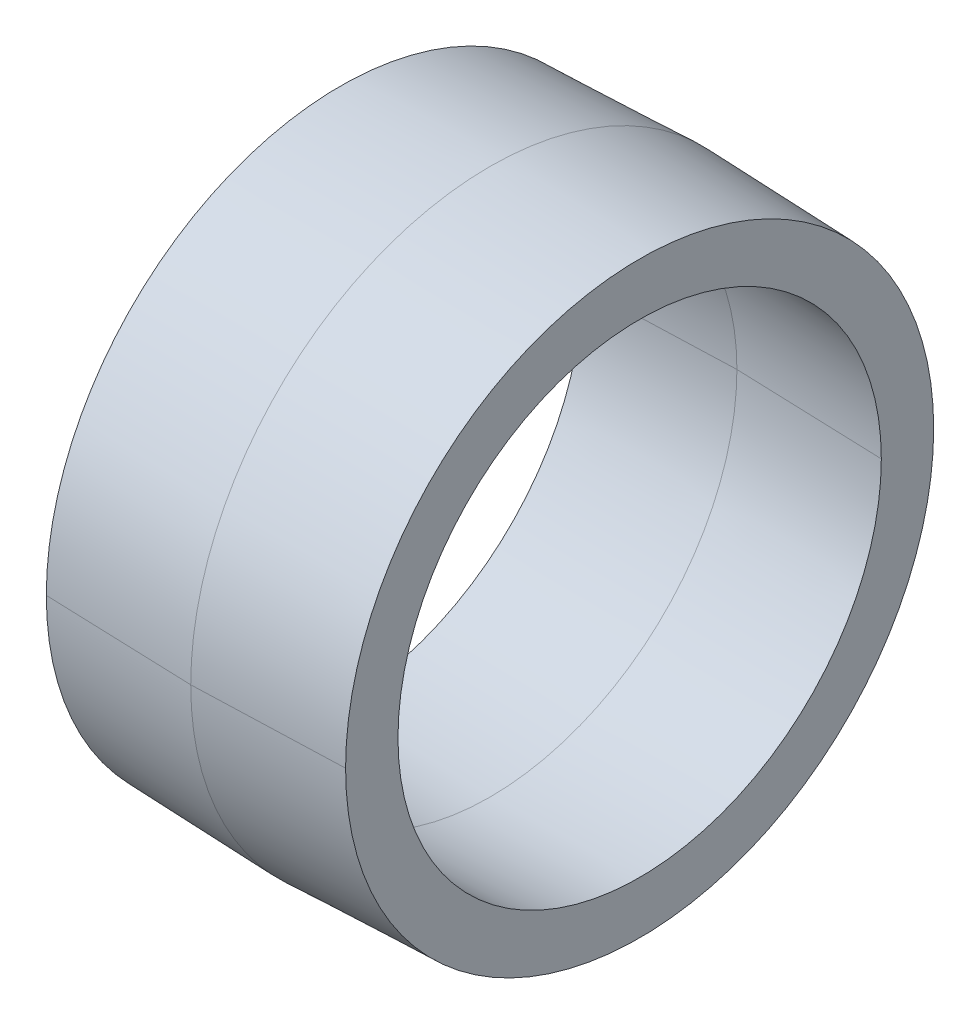
ISO-10303-21;
HEADER;
FILE_DESCRIPTION(('STEP AP214'),'2;1');
FILE_NAME('part.step','',(''),(''),'','','');
FILE_SCHEMA(('AUTOMOTIVE_DESIGN { 1 0 10303 214 1 1 1 1 }'));
ENDSEC;
DATA;
#1=APPLICATION_CONTEXT('core data for automotive mechanical design processes');
#2=APPLICATION_PROTOCOL_DEFINITION('international standard','automotive_design',2000,#1);
#3=PRODUCT_CONTEXT('',#1,'mechanical');
#4=PRODUCT('Part','Part','',(#3));
#5=PRODUCT_RELATED_PRODUCT_CATEGORY('part','',(#4));
#6=PRODUCT_DEFINITION_FORMATION('','',#4);
#7=PRODUCT_DEFINITION_CONTEXT('part definition',#1,'design');
#8=PRODUCT_DEFINITION('design','',#6,#7);
#9=PRODUCT_DEFINITION_SHAPE('','',#8);
#10=(LENGTH_UNIT() NAMED_UNIT(*) SI_UNIT(.MILLI.,.METRE.));
#11=(NAMED_UNIT(*) PLANE_ANGLE_UNIT() SI_UNIT($,.RADIAN.));
#12=(NAMED_UNIT(*) SI_UNIT($,.STERADIAN.) SOLID_ANGLE_UNIT());
#13=UNCERTAINTY_MEASURE_WITH_UNIT(LENGTH_MEASURE(1.E-05),#10,'distance_accuracy_value','');
#14=(GEOMETRIC_REPRESENTATION_CONTEXT(3) GLOBAL_UNCERTAINTY_ASSIGNED_CONTEXT((#13)) GLOBAL_UNIT_ASSIGNED_CONTEXT((#10,
#11,#12)) REPRESENTATION_CONTEXT('',''));
#15=CARTESIAN_POINT('',(0.,0.,0.));
#16=DIRECTION('',(0.,0.,1.));
#17=DIRECTION('',(1.,0.,0.));
#18=AXIS2_PLACEMENT_3D('',#15,#16,#17);
#19=CARTESIAN_POINT('',(0.,0.,0.));
#20=DIRECTION('',(1.,0.,0.));
#21=DIRECTION('',(0.,0.,-1.));
#22=AXIS2_PLACEMENT_3D('',#19,#20,#21);
#23=CONICAL_SURFACE('',#22,25.4,0.0349065850398857);
#24=CARTESIAN_POINT('',(-12.7,0.,0.));
#25=DIRECTION('',(-1.,0.,0.));
#26=DIRECTION('',(0.,0.,1.));
#27=AXIS2_PLACEMENT_3D('',#24,#25,#26);
#28=CIRCLE('',#27,24.9565062274548);
#29=CARTESIAN_POINT('',(-12.7,0.,24.9565062274548));
#30=VERTEX_POINT('',#29);
#31=CARTESIAN_POINT('',(-12.7,0.,-24.9565062274548));
#32=VERTEX_POINT('',#31);
#33=EDGE_CURVE('E40',#30,#32,#28,.T.);
#34=ORIENTED_EDGE('',*,*,#33,.F.);
#35=DIRECTION('',(0.999390827019096,0.,0.0348994967025016));
#36=VECTOR('',#35,1.);
#37=CARTESIAN_POINT('',(0.,0.,25.4));
#38=LINE('',#37,#36);
#39=CARTESIAN_POINT('',(0.,0.,25.4));
#40=VERTEX_POINT('',#39);
#41=EDGE_CURVE('E10',#30,#40,#38,.T.);
#42=ORIENTED_EDGE('',*,*,#41,.T.);
#43=CARTESIAN_POINT('',(0.,0.,0.));
#44=DIRECTION('',(-1.,0.,0.));
#45=DIRECTION('',(0.,0.,1.));
#46=AXIS2_PLACEMENT_3D('',#43,#44,#45);
#47=CIRCLE('',#46,25.4);
#48=CARTESIAN_POINT('',(0.,0.,-25.4));
#49=VERTEX_POINT('',#48);
#50=EDGE_CURVE('E26',#40,#49,#47,.T.);
#51=ORIENTED_EDGE('',*,*,#50,.T.);
#52=DIRECTION('',(0.999390827019096,0.,-0.0348994967025016));
#53=VECTOR('',#52,1.);
#54=CARTESIAN_POINT('',(0.,0.,-25.4));
#55=LINE('',#54,#53);
#56=EDGE_CURVE('E127',#32,#49,#55,.T.);
#57=ORIENTED_EDGE('',*,*,#56,.F.);
#58=EDGE_LOOP('',(#34,#42,#51,#57));
#59=FACE_BOUND('',#58,.T.);
#60=ADVANCED_FACE('F15',(#59),#23,.T.);
#61=CARTESIAN_POINT('',(12.7,0.,0.));
#62=DIRECTION('',(-1.,0.,0.));
#63=DIRECTION('',(0.,0.,1.));
#64=AXIS2_PLACEMENT_3D('',#61,#62,#63);
#65=CONICAL_SURFACE('',#64,24.9565062274548,0.0349065850398857);
#66=CARTESIAN_POINT('',(12.7,0.,0.));
#67=DIRECTION('',(-1.,0.,0.));
#68=DIRECTION('',(0.,0.,1.));
#69=AXIS2_PLACEMENT_3D('',#66,#67,#68);
#70=CIRCLE('',#69,24.9565062274548);
#71=CARTESIAN_POINT('',(12.7,0.,24.9565062274548));
#72=VERTEX_POINT('',#71);
#73=CARTESIAN_POINT('',(12.7,0.,-24.9565062274548));
#74=VERTEX_POINT('',#73);
#75=EDGE_CURVE('E146',#72,#74,#70,.T.);
#76=ORIENTED_EDGE('',*,*,#75,.T.);
#77=DIRECTION('',(-0.999390827019096,0.,-0.0348994967025011));
#78=VECTOR('',#77,1.);
#79=CARTESIAN_POINT('',(12.7,0.,-24.9565062274548));
#80=LINE('',#79,#78);
#81=EDGE_CURVE('E144',#74,#49,#80,.T.);
#82=ORIENTED_EDGE('',*,*,#81,.T.);
#83=ORIENTED_EDGE('',*,*,#50,.F.);
#84=DIRECTION('',(-0.999390827019096,0.,0.0348994967025011));
#85=VECTOR('',#84,1.);
#86=CARTESIAN_POINT('',(12.7,0.,24.9565062274548));
#87=LINE('',#86,#85);
#88=EDGE_CURVE('E19',#72,#40,#87,.T.);
#89=ORIENTED_EDGE('',*,*,#88,.F.);
#90=EDGE_LOOP('',(#76,#82,#83,#89));
#91=FACE_BOUND('',#90,.T.);
#92=ADVANCED_FACE('F191',(#91),#65,.T.);
#93=CARTESIAN_POINT('',(0.,0.,0.));
#94=DIRECTION('',(-1.,0.,0.));
#95=DIRECTION('',(0.,0.,1.));
#96=AXIS2_PLACEMENT_3D('',#93,#94,#95);
#97=CONICAL_SURFACE('',#96,20.955,0.0349065850398857);
#98=CARTESIAN_POINT('',(12.7,0.,0.));
#99=DIRECTION('',(-1.,0.,0.));
#100=DIRECTION('',(0.,0.,1.));
#101=AXIS2_PLACEMENT_3D('',#98,#99,#100);
#102=CIRCLE('',#101,20.5115062274548);
#103=CARTESIAN_POINT('',(12.7,0.,-20.5115062274548));
#104=VERTEX_POINT('',#103);
#105=CARTESIAN_POINT('',(12.7,0.,20.5115062274548));
#106=VERTEX_POINT('',#105);
#107=EDGE_CURVE('E60',#104,#106,#102,.T.);
#108=ORIENTED_EDGE('',*,*,#107,.F.);
#109=DIRECTION('',(-0.999390827019096,0.,-0.0348994967025011));
#110=VECTOR('',#109,1.);
#111=CARTESIAN_POINT('',(0.,0.,-20.955));
#112=LINE('',#111,#110);
#113=CARTESIAN_POINT('',(0.,0.,-20.955));
#114=VERTEX_POINT('',#113);
#115=EDGE_CURVE('E112',#104,#114,#112,.T.);
#116=ORIENTED_EDGE('',*,*,#115,.T.);
#117=CARTESIAN_POINT('',(0.,0.,0.));
#118=DIRECTION('',(-1.,0.,0.));
#119=DIRECTION('',(0.,0.,1.));
#120=AXIS2_PLACEMENT_3D('',#117,#118,#119);
#121=CIRCLE('',#120,20.955);
#122=CARTESIAN_POINT('',(0.,0.,20.955));
#123=VERTEX_POINT('',#122);
#124=EDGE_CURVE('E105',#114,#123,#121,.T.);
#125=ORIENTED_EDGE('',*,*,#124,.T.);
#126=DIRECTION('',(-0.999390827019096,0.,0.0348994967025011));
#127=VECTOR('',#126,1.);
#128=CARTESIAN_POINT('',(0.,0.,20.955));
#129=LINE('',#128,#127);
#130=EDGE_CURVE('E103',#106,#123,#129,.T.);
#131=ORIENTED_EDGE('',*,*,#130,.F.);
#132=EDGE_LOOP('',(#108,#116,#125,#131));
#133=FACE_BOUND('',#132,.T.);
#134=ADVANCED_FACE('F104',(#133),#97,.F.);
#135=CARTESIAN_POINT('',(-12.7,0.,0.));
#136=DIRECTION('',(1.,0.,0.));
#137=DIRECTION('',(0.,0.,-1.));
#138=AXIS2_PLACEMENT_3D('',#135,#136,#137);
#139=CONICAL_SURFACE('',#138,20.5115062274548,0.0349065850398857);
#140=CARTESIAN_POINT('',(-12.7,0.,0.));
#141=DIRECTION('',(-1.,0.,0.));
#142=DIRECTION('',(0.,0.,1.));
#143=AXIS2_PLACEMENT_3D('',#140,#141,#142);
#144=CIRCLE('',#143,20.5115062274548);
#145=CARTESIAN_POINT('',(-12.7,0.,-20.5115062274548));
#146=VERTEX_POINT('',#145);
#147=CARTESIAN_POINT('',(-12.7,0.,20.5115062274548));
#148=VERTEX_POINT('',#147);
#149=EDGE_CURVE('E149',#146,#148,#144,.T.);
#150=ORIENTED_EDGE('',*,*,#149,.T.);
#151=DIRECTION('',(0.999390827019096,0.,0.0348994967025016));
#152=VECTOR('',#151,1.);
#153=CARTESIAN_POINT('',(-12.7,0.,20.5115062274548));
#154=LINE('',#153,#152);
#155=EDGE_CURVE('E147',#148,#123,#154,.T.);
#156=ORIENTED_EDGE('',*,*,#155,.T.);
#157=ORIENTED_EDGE('',*,*,#124,.F.);
#158=DIRECTION('',(0.999390827019096,0.,-0.0348994967025016));
#159=VECTOR('',#158,1.);
#160=CARTESIAN_POINT('',(-12.7,0.,-20.5115062274548));
#161=LINE('',#160,#159);
#162=EDGE_CURVE('E78',#146,#114,#161,.T.);
#163=ORIENTED_EDGE('',*,*,#162,.F.);
#164=EDGE_LOOP('',(#150,#156,#157,#163));
#165=FACE_BOUND('',#164,.T.);
#166=ADVANCED_FACE('F203',(#165),#139,.F.);
#167=CARTESIAN_POINT('',(-12.7,24.9565062274548,0.));
#168=DIRECTION('',(1.,0.,0.));
#169=DIRECTION('',(0.,1.,0.));
#170=AXIS2_PLACEMENT_3D('',#167,#168,#169);
#171=PLANE('',#170);
#172=CARTESIAN_POINT('',(-12.7,0.,0.));
#173=DIRECTION('',(-1.,0.,0.));
#174=DIRECTION('',(0.,0.,1.));
#175=AXIS2_PLACEMENT_3D('',#172,#173,#174);
#176=CIRCLE('',#175,24.9565062274548);
#177=EDGE_CURVE('E150',#32,#30,#176,.T.);
#178=ORIENTED_EDGE('',*,*,#177,.T.);
#179=ORIENTED_EDGE('',*,*,#33,.T.);
#180=EDGE_LOOP('',(#178,#179));
#181=FACE_BOUND('',#180,.T.);
#182=ORIENTED_EDGE('',*,*,#149,.F.);
#183=CARTESIAN_POINT('',(-12.7,0.,0.));
#184=DIRECTION('',(-1.,0.,0.));
#185=DIRECTION('',(0.,0.,1.));
#186=AXIS2_PLACEMENT_3D('',#183,#184,#185);
#187=CIRCLE('',#186,20.5115062274548);
#188=EDGE_CURVE('E156',#148,#146,#187,.T.);
#189=ORIENTED_EDGE('',*,*,#188,.F.);
#190=EDGE_LOOP('',(#182,#189));
#191=FACE_BOUND('',#190,.T.);
#192=ADVANCED_FACE('F180',(#181,#191),#171,.F.);
#193=CARTESIAN_POINT('',(-12.7,0.,0.));
#194=DIRECTION('',(1.,0.,0.));
#195=DIRECTION('',(0.,0.,-1.));
#196=AXIS2_PLACEMENT_3D('',#193,#194,#195);
#197=CONICAL_SURFACE('',#196,20.5115062274548,0.0349065850398857);
#198=ORIENTED_EDGE('',*,*,#155,.F.);
#199=ORIENTED_EDGE('',*,*,#188,.T.);
#200=ORIENTED_EDGE('',*,*,#162,.T.);
#201=CARTESIAN_POINT('',(0.,0.,0.));
#202=DIRECTION('',(-1.,0.,0.));
#203=DIRECTION('',(0.,0.,1.));
#204=AXIS2_PLACEMENT_3D('',#201,#202,#203);
#205=CIRCLE('',#204,20.955);
#206=EDGE_CURVE('E110',#123,#114,#205,.T.);
#207=ORIENTED_EDGE('',*,*,#206,.F.);
#208=EDGE_LOOP('',(#198,#199,#200,#207));
#209=FACE_BOUND('',#208,.T.);
#210=ADVANCED_FACE('F202',(#209),#197,.F.);
#211=CARTESIAN_POINT('',(0.,0.,0.));
#212=DIRECTION('',(-1.,0.,0.));
#213=DIRECTION('',(0.,0.,1.));
#214=AXIS2_PLACEMENT_3D('',#211,#212,#213);
#215=CONICAL_SURFACE('',#214,20.955,0.0349065850398857);
#216=ORIENTED_EDGE('',*,*,#115,.F.);
#217=CARTESIAN_POINT('',(12.7,0.,0.));
#218=DIRECTION('',(-1.,0.,0.));
#219=DIRECTION('',(0.,0.,1.));
#220=AXIS2_PLACEMENT_3D('',#217,#218,#219);
#221=CIRCLE('',#220,20.5115062274548);
#222=EDGE_CURVE('E98',#106,#104,#221,.T.);
#223=ORIENTED_EDGE('',*,*,#222,.F.);
#224=ORIENTED_EDGE('',*,*,#130,.T.);
#225=ORIENTED_EDGE('',*,*,#206,.T.);
#226=EDGE_LOOP('',(#216,#223,#224,#225));
#227=FACE_BOUND('',#226,.T.);
#228=ADVANCED_FACE('F17',(#227),#215,.F.);
#229=CARTESIAN_POINT('',(12.7,24.9565062274548,0.));
#230=DIRECTION('',(-1.,0.,0.));
#231=DIRECTION('',(0.,0.,1.));
#232=AXIS2_PLACEMENT_3D('',#229,#230,#231);
#233=PLANE('',#232);
#234=ORIENTED_EDGE('',*,*,#75,.F.);
#235=CARTESIAN_POINT('',(12.7,0.,0.));
#236=DIRECTION('',(-1.,0.,0.));
#237=DIRECTION('',(0.,0.,1.));
#238=AXIS2_PLACEMENT_3D('',#235,#236,#237);
#239=CIRCLE('',#238,24.9565062274548);
#240=EDGE_CURVE('E100',#74,#72,#239,.T.);
#241=ORIENTED_EDGE('',*,*,#240,.F.);
#242=EDGE_LOOP('',(#234,#241));
#243=FACE_BOUND('',#242,.T.);
#244=ORIENTED_EDGE('',*,*,#222,.T.);
#245=ORIENTED_EDGE('',*,*,#107,.T.);
#246=EDGE_LOOP('',(#244,#245));
#247=FACE_BOUND('',#246,.T.);
#248=ADVANCED_FACE('F96',(#243,#247),#233,.F.);
#249=CARTESIAN_POINT('',(12.7,0.,0.));
#250=DIRECTION('',(-1.,0.,0.));
#251=DIRECTION('',(0.,0.,1.));
#252=AXIS2_PLACEMENT_3D('',#249,#250,#251);
#253=CONICAL_SURFACE('',#252,24.9565062274548,0.0349065850398857);
#254=ORIENTED_EDGE('',*,*,#81,.F.);
#255=ORIENTED_EDGE('',*,*,#240,.T.);
#256=ORIENTED_EDGE('',*,*,#88,.T.);
#257=CARTESIAN_POINT('',(0.,0.,0.));
#258=DIRECTION('',(-1.,0.,0.));
#259=DIRECTION('',(0.,0.,1.));
#260=AXIS2_PLACEMENT_3D('',#257,#258,#259);
#261=CIRCLE('',#260,25.4);
#262=EDGE_CURVE('E124',#49,#40,#261,.T.);
#263=ORIENTED_EDGE('',*,*,#262,.F.);
#264=EDGE_LOOP('',(#254,#255,#256,#263));
#265=FACE_BOUND('',#264,.T.);
#266=ADVANCED_FACE('F190',(#265),#253,.T.);
#267=CARTESIAN_POINT('',(0.,0.,0.));
#268=DIRECTION('',(1.,0.,0.));
#269=DIRECTION('',(0.,0.,-1.));
#270=AXIS2_PLACEMENT_3D('',#267,#268,#269);
#271=CONICAL_SURFACE('',#270,25.4,0.0349065850398857);
#272=ORIENTED_EDGE('',*,*,#41,.F.);
#273=ORIENTED_EDGE('',*,*,#177,.F.);
#274=ORIENTED_EDGE('',*,*,#56,.T.);
#275=ORIENTED_EDGE('',*,*,#262,.T.);
#276=EDGE_LOOP('',(#272,#273,#274,#275));
#277=FACE_BOUND('',#276,.T.);
#278=ADVANCED_FACE('F182',(#277),#271,.T.);
#279=CLOSED_SHELL('',(#60,#92,#134,#166,#192,#210,#228,#248,#266,#278));
#280=MANIFOLD_SOLID_BREP('B1',#279);
#281=ADVANCED_BREP_SHAPE_REPRESENTATION('',(#18,#280),#14);
#282=SHAPE_DEFINITION_REPRESENTATION(#9,#281);
ENDSEC;
END-ISO-10303-21;
